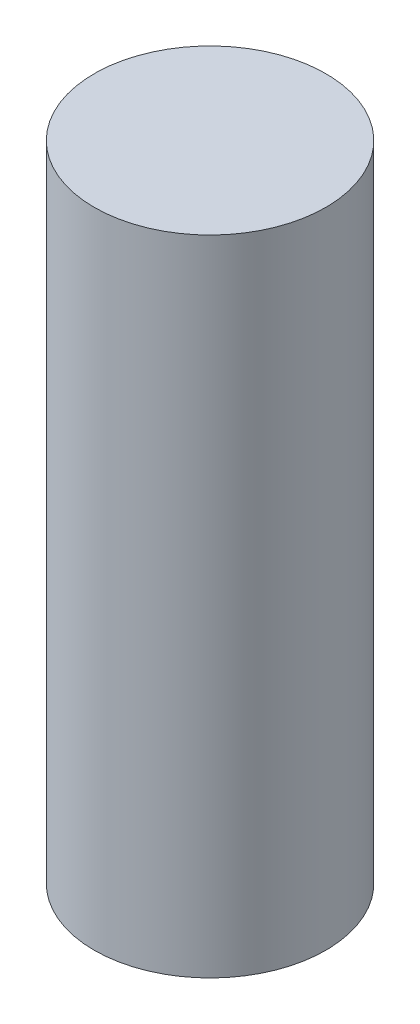
ISO-10303-21;
HEADER;
FILE_DESCRIPTION(('STEP AP214'),'2;1');
FILE_NAME('part.step','',(''),(''),'','','');
FILE_SCHEMA(('AUTOMOTIVE_DESIGN { 1 0 10303 214 1 1 1 1 }'));
ENDSEC;
DATA;
#1=APPLICATION_CONTEXT('core data for automotive mechanical design processes');
#2=APPLICATION_PROTOCOL_DEFINITION('international standard','automotive_design',2000,#1);
#3=PRODUCT_CONTEXT('',#1,'mechanical');
#4=PRODUCT('Part','Part','',(#3));
#5=PRODUCT_RELATED_PRODUCT_CATEGORY('part','',(#4));
#6=PRODUCT_DEFINITION_FORMATION('','',#4);
#7=PRODUCT_DEFINITION_CONTEXT('part definition',#1,'design');
#8=PRODUCT_DEFINITION('design','',#6,#7);
#9=PRODUCT_DEFINITION_SHAPE('','',#8);
#10=(LENGTH_UNIT() NAMED_UNIT(*) SI_UNIT(.MILLI.,.METRE.));
#11=(NAMED_UNIT(*) PLANE_ANGLE_UNIT() SI_UNIT($,.RADIAN.));
#12=(NAMED_UNIT(*) SI_UNIT($,.STERADIAN.) SOLID_ANGLE_UNIT());
#13=UNCERTAINTY_MEASURE_WITH_UNIT(LENGTH_MEASURE(1.E-05),#10,'distance_accuracy_value','');
#14=(GEOMETRIC_REPRESENTATION_CONTEXT(3) GLOBAL_UNCERTAINTY_ASSIGNED_CONTEXT((#13)) GLOBAL_UNIT_ASSIGNED_CONTEXT((#10,
#11,#12)) REPRESENTATION_CONTEXT('',''));
#15=CARTESIAN_POINT('',(0.,0.,0.));
#16=DIRECTION('',(0.,0.,1.));
#17=DIRECTION('',(1.,0.,0.));
#18=AXIS2_PLACEMENT_3D('',#15,#16,#17);
#19=CARTESIAN_POINT('',(0.,10.,0.));
#20=DIRECTION('',(0.,-1.,0.));
#21=DIRECTION('',(0.,0.,-1.));
#22=AXIS2_PLACEMENT_3D('',#19,#20,#21);
#23=CYLINDRICAL_SURFACE('',#22,1.8);
#24=CARTESIAN_POINT('',(0.,10.,0.));
#25=DIRECTION('',(0.,1.,0.));
#26=DIRECTION('',(0.,0.,1.));
#27=AXIS2_PLACEMENT_3D('',#24,#25,#26);
#28=CIRCLE('',#27,1.8);
#29=CARTESIAN_POINT('',(0.,10.,1.8));
#30=VERTEX_POINT('',#29);
#31=EDGE_CURVE('E10',#30,#30,#28,.T.);
#32=ORIENTED_EDGE('',*,*,#31,.F.);
#33=EDGE_LOOP('',(#32));
#34=FACE_BOUND('',#33,.T.);
#35=CARTESIAN_POINT('',(0.,0.,0.));
#36=DIRECTION('',(0.,1.,0.));
#37=DIRECTION('',(0.,0.,1.));
#38=AXIS2_PLACEMENT_3D('',#35,#36,#37);
#39=CIRCLE('',#38,1.8);
#40=CARTESIAN_POINT('',(0.,0.,1.8));
#41=VERTEX_POINT('',#40);
#42=EDGE_CURVE('E40',#41,#41,#39,.T.);
#43=ORIENTED_EDGE('',*,*,#42,.T.);
#44=EDGE_LOOP('',(#43));
#45=FACE_BOUND('',#44,.T.);
#46=ADVANCED_FACE('F37',(#34,#45),#23,.T.);
#47=CARTESIAN_POINT('',(0.,10.,0.));
#48=DIRECTION('',(0.,1.,0.));
#49=DIRECTION('',(0.,0.,1.));
#50=AXIS2_PLACEMENT_3D('',#47,#48,#49);
#51=PLANE('',#50);
#52=ORIENTED_EDGE('',*,*,#31,.T.);
#53=EDGE_LOOP('',(#52));
#54=FACE_BOUND('',#53,.T.);
#55=ADVANCED_FACE('F52',(#54),#51,.T.);
#56=CARTESIAN_POINT('',(0.,0.,0.));
#57=DIRECTION('',(0.,1.,0.));
#58=DIRECTION('',(0.,0.,1.));
#59=AXIS2_PLACEMENT_3D('',#56,#57,#58);
#60=PLANE('',#59);
#61=ORIENTED_EDGE('',*,*,#42,.F.);
#62=EDGE_LOOP('',(#61));
#63=FACE_BOUND('',#62,.T.);
#64=ADVANCED_FACE('F50',(#63),#60,.F.);
#65=CLOSED_SHELL('',(#46,#55,#64));
#66=MANIFOLD_SOLID_BREP('B2',#65);
#67=ADVANCED_BREP_SHAPE_REPRESENTATION('',(#18,#66),#14);
#68=SHAPE_DEFINITION_REPRESENTATION(#9,#67);
ENDSEC;
END-ISO-10303-21;
